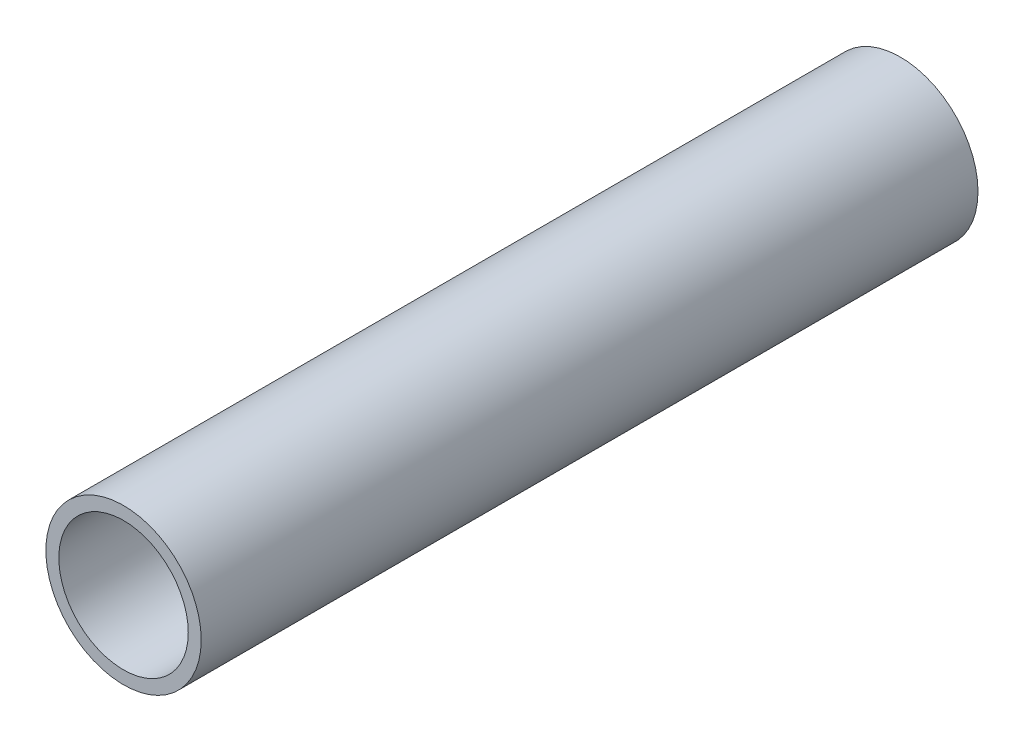
ISO-10303-21;
HEADER;
FILE_DESCRIPTION(('STEP AP214'),'2;1');
FILE_NAME('part.step','',(''),(''),'','','');
FILE_SCHEMA(('AUTOMOTIVE_DESIGN { 1 0 10303 214 1 1 1 1 }'));
ENDSEC;
DATA;
#1=APPLICATION_CONTEXT('core data for automotive mechanical design processes');
#2=APPLICATION_PROTOCOL_DEFINITION('international standard','automotive_design',2000,#1);
#3=PRODUCT_CONTEXT('',#1,'mechanical');
#4=PRODUCT('Part','Part','',(#3));
#5=PRODUCT_RELATED_PRODUCT_CATEGORY('part','',(#4));
#6=PRODUCT_DEFINITION_FORMATION('','',#4);
#7=PRODUCT_DEFINITION_CONTEXT('part definition',#1,'design');
#8=PRODUCT_DEFINITION('design','',#6,#7);
#9=PRODUCT_DEFINITION_SHAPE('','',#8);
#10=(LENGTH_UNIT() NAMED_UNIT(*) SI_UNIT(.MILLI.,.METRE.));
#11=(NAMED_UNIT(*) PLANE_ANGLE_UNIT() SI_UNIT($,.RADIAN.));
#12=(NAMED_UNIT(*) SI_UNIT($,.STERADIAN.) SOLID_ANGLE_UNIT());
#13=UNCERTAINTY_MEASURE_WITH_UNIT(LENGTH_MEASURE(1.E-05),#10,'distance_accuracy_value','');
#14=(GEOMETRIC_REPRESENTATION_CONTEXT(3) GLOBAL_UNCERTAINTY_ASSIGNED_CONTEXT((#13)) GLOBAL_UNIT_ASSIGNED_CONTEXT((#10,
#11,#12)) REPRESENTATION_CONTEXT('',''));
#15=CARTESIAN_POINT('',(0.,0.,0.));
#16=DIRECTION('',(0.,0.,1.));
#17=DIRECTION('',(1.,0.,0.));
#18=AXIS2_PLACEMENT_3D('',#15,#16,#17);
#19=CARTESIAN_POINT('',(0.,0.,30.));
#20=DIRECTION('',(0.,0.,1.));
#21=DIRECTION('',(1.,0.,0.));
#22=AXIS2_PLACEMENT_3D('',#19,#20,#21);
#23=PLANE('',#22);
#24=CARTESIAN_POINT('',(0.,0.,30.));
#25=DIRECTION('',(0.,0.,1.));
#26=DIRECTION('',(1.,0.,0.));
#27=AXIS2_PLACEMENT_3D('',#24,#25,#26);
#28=CIRCLE('',#27,3.);
#29=CARTESIAN_POINT('',(3.,0.,30.));
#30=VERTEX_POINT('',#29);
#31=EDGE_CURVE('E10',#30,#30,#28,.T.);
#32=ORIENTED_EDGE('',*,*,#31,.T.);
#33=EDGE_LOOP('',(#32));
#34=FACE_BOUND('',#33,.T.);
#35=CARTESIAN_POINT('',(0.,0.,30.));
#36=DIRECTION('',(0.,0.,1.));
#37=DIRECTION('',(1.,0.,0.));
#38=AXIS2_PLACEMENT_3D('',#35,#36,#37);
#39=CIRCLE('',#38,2.5);
#40=CARTESIAN_POINT('',(2.5,0.,30.));
#41=VERTEX_POINT('',#40);
#42=EDGE_CURVE('E43',#41,#41,#39,.T.);
#43=ORIENTED_EDGE('',*,*,#42,.F.);
#44=EDGE_LOOP('',(#43));
#45=FACE_BOUND('',#44,.T.);
#46=ADVANCED_FACE('F32',(#34,#45),#23,.T.);
#47=CARTESIAN_POINT('',(0.,0.,0.));
#48=DIRECTION('',(0.,0.,1.));
#49=DIRECTION('',(1.,0.,0.));
#50=AXIS2_PLACEMENT_3D('',#47,#48,#49);
#51=PLANE('',#50);
#52=CARTESIAN_POINT('',(0.,0.,0.));
#53=DIRECTION('',(0.,0.,1.));
#54=DIRECTION('',(1.,0.,0.));
#55=AXIS2_PLACEMENT_3D('',#52,#53,#54);
#56=CIRCLE('',#55,3.);
#57=CARTESIAN_POINT('',(3.,0.,0.));
#58=VERTEX_POINT('',#57);
#59=EDGE_CURVE('E36',#58,#58,#56,.T.);
#60=ORIENTED_EDGE('',*,*,#59,.F.);
#61=EDGE_LOOP('',(#60));
#62=FACE_BOUND('',#61,.T.);
#63=CARTESIAN_POINT('',(0.,0.,0.));
#64=DIRECTION('',(0.,0.,1.));
#65=DIRECTION('',(1.,0.,0.));
#66=AXIS2_PLACEMENT_3D('',#63,#64,#65);
#67=CIRCLE('',#66,2.5);
#68=CARTESIAN_POINT('',(2.5,0.,0.));
#69=VERTEX_POINT('',#68);
#70=EDGE_CURVE('E45',#69,#69,#67,.T.);
#71=ORIENTED_EDGE('',*,*,#70,.T.);
#72=EDGE_LOOP('',(#71));
#73=FACE_BOUND('',#72,.T.);
#74=ADVANCED_FACE('F55',(#62,#73),#51,.F.);
#75=CARTESIAN_POINT('',(0.,0.,30.));
#76=DIRECTION('',(0.,0.,-1.));
#77=DIRECTION('',(-1.,0.,0.));
#78=AXIS2_PLACEMENT_3D('',#75,#76,#77);
#79=CYLINDRICAL_SURFACE('',#78,3.);
#80=ORIENTED_EDGE('',*,*,#31,.F.);
#81=EDGE_LOOP('',(#80));
#82=FACE_BOUND('',#81,.T.);
#83=ORIENTED_EDGE('',*,*,#59,.T.);
#84=EDGE_LOOP('',(#83));
#85=FACE_BOUND('',#84,.T.);
#86=ADVANCED_FACE('F34',(#82,#85),#79,.T.);
#87=CARTESIAN_POINT('',(0.,0.,30.));
#88=DIRECTION('',(0.,0.,-1.));
#89=DIRECTION('',(-1.,0.,0.));
#90=AXIS2_PLACEMENT_3D('',#87,#88,#89);
#91=CYLINDRICAL_SURFACE('',#90,2.5);
#92=ORIENTED_EDGE('',*,*,#42,.T.);
#93=EDGE_LOOP('',(#92));
#94=FACE_BOUND('',#93,.T.);
#95=ORIENTED_EDGE('',*,*,#70,.F.);
#96=EDGE_LOOP('',(#95));
#97=FACE_BOUND('',#96,.T.);
#98=ADVANCED_FACE('F51',(#94,#97),#91,.F.);
#99=CLOSED_SHELL('',(#46,#74,#86,#98));
#100=MANIFOLD_SOLID_BREP('B2',#99);
#101=ADVANCED_BREP_SHAPE_REPRESENTATION('',(#18,#100),#14);
#102=SHAPE_DEFINITION_REPRESENTATION(#9,#101);
ENDSEC;
END-ISO-10303-21;
